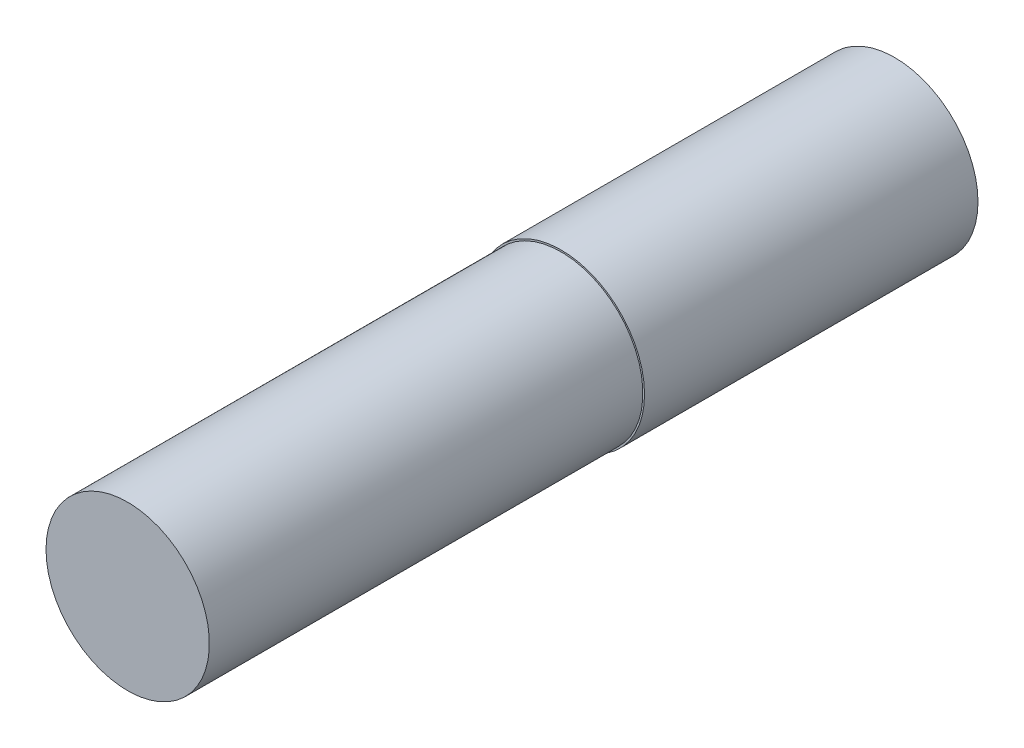
ISO-10303-21;
HEADER;
FILE_DESCRIPTION(('STEP AP214'),'2;1');
FILE_NAME('part.step','',(''),(''),'','','');
FILE_SCHEMA(('AUTOMOTIVE_DESIGN { 1 0 10303 214 1 1 1 1 }'));
ENDSEC;
DATA;
#1=APPLICATION_CONTEXT('core data for automotive mechanical design processes');
#2=APPLICATION_PROTOCOL_DEFINITION('international standard','automotive_design',2000,#1);
#3=PRODUCT_CONTEXT('',#1,'mechanical');
#4=PRODUCT('Part','Part','',(#3));
#5=PRODUCT_RELATED_PRODUCT_CATEGORY('part','',(#4));
#6=PRODUCT_DEFINITION_FORMATION('','',#4);
#7=PRODUCT_DEFINITION_CONTEXT('part definition',#1,'design');
#8=PRODUCT_DEFINITION('design','',#6,#7);
#9=PRODUCT_DEFINITION_SHAPE('','',#8);
#10=(LENGTH_UNIT() NAMED_UNIT(*) SI_UNIT(.MILLI.,.METRE.));
#11=(NAMED_UNIT(*) PLANE_ANGLE_UNIT() SI_UNIT($,.RADIAN.));
#12=(NAMED_UNIT(*) SI_UNIT($,.STERADIAN.) SOLID_ANGLE_UNIT());
#13=UNCERTAINTY_MEASURE_WITH_UNIT(LENGTH_MEASURE(1.E-05),#10,'distance_accuracy_value','');
#14=(GEOMETRIC_REPRESENTATION_CONTEXT(3) GLOBAL_UNCERTAINTY_ASSIGNED_CONTEXT((#13)) GLOBAL_UNIT_ASSIGNED_CONTEXT((#10,
#11,#12)) REPRESENTATION_CONTEXT('',''));
#15=CARTESIAN_POINT('',(0.,0.,0.));
#16=DIRECTION('',(0.,0.,1.));
#17=DIRECTION('',(1.,0.,0.));
#18=AXIS2_PLACEMENT_3D('',#15,#16,#17);
#19=CARTESIAN_POINT('',(0.,0.,10.));
#20=DIRECTION('',(0.,0.,-1.));
#21=DIRECTION('',(-1.,0.,0.));
#22=AXIS2_PLACEMENT_3D('',#19,#20,#21);
#23=CYLINDRICAL_SURFACE('',#22,2.5);
#24=CARTESIAN_POINT('',(0.,0.,10.));
#25=DIRECTION('',(0.,0.,1.));
#26=DIRECTION('',(1.,0.,0.));
#27=AXIS2_PLACEMENT_3D('',#24,#25,#26);
#28=CIRCLE('',#27,2.5);
#29=CARTESIAN_POINT('',(2.5,0.,10.));
#30=VERTEX_POINT('',#29);
#31=EDGE_CURVE('E39',#30,#30,#28,.T.);
#32=ORIENTED_EDGE('',*,*,#31,.F.);
#33=EDGE_LOOP('',(#32));
#34=FACE_BOUND('',#33,.T.);
#35=CARTESIAN_POINT('',(0.,0.,0.));
#36=DIRECTION('',(0.,0.,1.));
#37=DIRECTION('',(1.,0.,0.));
#38=AXIS2_PLACEMENT_3D('',#35,#36,#37);
#39=CIRCLE('',#38,2.5);
#40=CARTESIAN_POINT('',(2.5,0.,0.));
#41=VERTEX_POINT('',#40);
#42=EDGE_CURVE('E35',#41,#41,#39,.T.);
#43=ORIENTED_EDGE('',*,*,#42,.T.);
#44=EDGE_LOOP('',(#43));
#45=FACE_BOUND('',#44,.T.);
#46=ADVANCED_FACE('F32',(#34,#45),#23,.T.);
#47=CARTESIAN_POINT('',(0.,0.,10.));
#48=DIRECTION('',(0.,0.,1.));
#49=DIRECTION('',(1.,0.,0.));
#50=AXIS2_PLACEMENT_3D('',#47,#48,#49);
#51=PLANE('',#50);
#52=CARTESIAN_POINT('',(0.,0.,10.));
#53=DIRECTION('',(0.,0.,1.));
#54=DIRECTION('',(1.,0.,0.));
#55=AXIS2_PLACEMENT_3D('',#52,#53,#54);
#56=CIRCLE('',#55,2.45);
#57=CARTESIAN_POINT('',(-2.45,0.,10.));
#58=VERTEX_POINT('',#57);
#59=EDGE_CURVE('E10',#58,#58,#56,.T.);
#60=ORIENTED_EDGE('',*,*,#59,.F.);
#61=EDGE_LOOP('',(#60));
#62=FACE_BOUND('',#61,.T.);
#63=ORIENTED_EDGE('',*,*,#31,.T.);
#64=EDGE_LOOP('',(#63));
#65=FACE_BOUND('',#64,.T.);
#66=ADVANCED_FACE('F56',(#62,#65),#51,.T.);
#67=CARTESIAN_POINT('',(0.,0.,0.));
#68=DIRECTION('',(0.,0.,1.));
#69=DIRECTION('',(1.,0.,0.));
#70=AXIS2_PLACEMENT_3D('',#67,#68,#69);
#71=PLANE('',#70);
#72=ORIENTED_EDGE('',*,*,#42,.F.);
#73=EDGE_LOOP('',(#72));
#74=FACE_BOUND('',#73,.T.);
#75=ADVANCED_FACE('F53',(#74),#71,.F.);
#76=CARTESIAN_POINT('',(0.,0.,23.));
#77=DIRECTION('',(0.,0.,-1.));
#78=DIRECTION('',(-1.,0.,0.));
#79=AXIS2_PLACEMENT_3D('',#76,#77,#78);
#80=CYLINDRICAL_SURFACE('',#79,2.45);
#81=CARTESIAN_POINT('',(0.,0.,23.));
#82=DIRECTION('',(0.,0.,1.));
#83=DIRECTION('',(1.,0.,0.));
#84=AXIS2_PLACEMENT_3D('',#81,#82,#83);
#85=CIRCLE('',#84,2.45);
#86=CARTESIAN_POINT('',(-2.45,0.,23.));
#87=VERTEX_POINT('',#86);
#88=EDGE_CURVE('E45',#87,#87,#85,.T.);
#89=CARTESIAN_POINT('',(-2.45,0.,23.));
#90=CARTESIAN_POINT('',(-2.45,0.,22.8645833333333));
#91=CARTESIAN_POINT('',(-2.45,0.,22.7291666666667));
#92=CARTESIAN_POINT('',(-2.45,0.,22.4583333333333));
#93=CARTESIAN_POINT('',(-2.45,0.,22.3229166666667));
#94=CARTESIAN_POINT('',(-2.45,0.,22.0520833333333));
#95=CARTESIAN_POINT('',(-2.45,0.,21.9166666666667));
#96=CARTESIAN_POINT('',(-2.45,0.,21.6458333333333));
#97=CARTESIAN_POINT('',(-2.45,0.,21.5104166666667));
#98=CARTESIAN_POINT('',(-2.45,0.,21.2395833333333));
#99=CARTESIAN_POINT('',(-2.45,0.,21.1041666666667));
#100=CARTESIAN_POINT('',(-2.45,0.,20.8333333333333));
#101=CARTESIAN_POINT('',(-2.45,0.,20.6979166666667));
#102=CARTESIAN_POINT('',(-2.45,0.,20.4270833333333));
#103=CARTESIAN_POINT('',(-2.45,0.,20.2916666666667));
#104=CARTESIAN_POINT('',(-2.45,0.,20.0208333333333));
#105=CARTESIAN_POINT('',(-2.45,0.,19.8854166666667));
#106=CARTESIAN_POINT('',(-2.45,0.,19.6145833333333));
#107=CARTESIAN_POINT('',(-2.45,0.,19.4791666666667));
#108=CARTESIAN_POINT('',(-2.45,0.,19.2083333333333));
#109=CARTESIAN_POINT('',(-2.45,0.,19.0729166666667));
#110=CARTESIAN_POINT('',(-2.45,0.,18.8020833333333));
#111=CARTESIAN_POINT('',(-2.45,0.,18.6666666666667));
#112=CARTESIAN_POINT('',(-2.45,0.,18.3958333333333));
#113=CARTESIAN_POINT('',(-2.45,0.,18.2604166666667));
#114=CARTESIAN_POINT('',(-2.45,0.,17.9895833333333));
#115=CARTESIAN_POINT('',(-2.45,0.,17.8541666666667));
#116=CARTESIAN_POINT('',(-2.45,0.,17.5833333333333));
#117=CARTESIAN_POINT('',(-2.45,0.,17.4479166666667));
#118=CARTESIAN_POINT('',(-2.45,0.,17.1770833333333));
#119=CARTESIAN_POINT('',(-2.45,0.,17.0416666666667));
#120=CARTESIAN_POINT('',(-2.45,0.,16.7708333333333));
#121=CARTESIAN_POINT('',(-2.45,0.,16.6354166666667));
#122=CARTESIAN_POINT('',(-2.45,0.,16.3645833333333));
#123=CARTESIAN_POINT('',(-2.45,0.,16.2291666666667));
#124=CARTESIAN_POINT('',(-2.45,0.,15.9583333333333));
#125=CARTESIAN_POINT('',(-2.45,0.,15.8229166666667));
#126=CARTESIAN_POINT('',(-2.45,0.,15.5520833333333));
#127=CARTESIAN_POINT('',(-2.45,0.,15.4166666666667));
#128=CARTESIAN_POINT('',(-2.45,0.,15.1458333333333));
#129=CARTESIAN_POINT('',(-2.45,0.,15.0104166666667));
#130=CARTESIAN_POINT('',(-2.45,0.,14.7395833333333));
#131=CARTESIAN_POINT('',(-2.45,0.,14.6041666666667));
#132=CARTESIAN_POINT('',(-2.45,0.,14.3333333333333));
#133=CARTESIAN_POINT('',(-2.45,0.,14.1979166666667));
#134=CARTESIAN_POINT('',(-2.45,0.,13.9270833333333));
#135=CARTESIAN_POINT('',(-2.45,0.,13.7916666666667));
#136=CARTESIAN_POINT('',(-2.45,0.,13.5208333333333));
#137=CARTESIAN_POINT('',(-2.45,0.,13.3854166666667));
#138=CARTESIAN_POINT('',(-2.45,0.,13.1145833333333));
#139=CARTESIAN_POINT('',(-2.45,0.,12.9791666666667));
#140=CARTESIAN_POINT('',(-2.45,0.,12.7083333333333));
#141=CARTESIAN_POINT('',(-2.45,0.,12.5729166666667));
#142=CARTESIAN_POINT('',(-2.45,0.,12.3020833333333));
#143=CARTESIAN_POINT('',(-2.45,0.,12.1666666666667));
#144=CARTESIAN_POINT('',(-2.45,0.,11.8958333333333));
#145=CARTESIAN_POINT('',(-2.45,0.,11.7604166666667));
#146=CARTESIAN_POINT('',(-2.45,0.,11.4895833333333));
#147=CARTESIAN_POINT('',(-2.45,0.,11.3541666666667));
#148=CARTESIAN_POINT('',(-2.45,0.,11.0833333333333));
#149=CARTESIAN_POINT('',(-2.45,0.,10.9479166666667));
#150=CARTESIAN_POINT('',(-2.45,0.,10.6770833333333));
#151=CARTESIAN_POINT('',(-2.45,0.,10.5416666666667));
#152=CARTESIAN_POINT('',(-2.45,0.,10.2708333333333));
#153=CARTESIAN_POINT('',(-2.45,0.,10.1354166666667));
#154=CARTESIAN_POINT('',(-2.45,0.,10.));
#155=B_SPLINE_CURVE_WITH_KNOTS('',3,(#89,#90,#91,#92,#93,#94,#95,#96,#97,#98,#99,#100,#101,#102,
#103,#104,#105,#106,#107,#108,#109,#110,#111,#112,#113,#114,#115,#116,#117,#118,#119,#120,#121,
#122,#123,#124,#125,#126,#127,#128,#129,#130,#131,#132,#133,#134,#135,#136,#137,#138,#139,#140,
#141,#142,#143,#144,#145,#146,#147,#148,#149,#150,#151,#152,#153,#154),.UNSPECIFIED.,.F.,.F.,(4,
2,2,2,2,2,2,2,2,2,2,2,2,2,2,2,2,2,2,2,2,2,2,2,2,2,2,2,2,2,2,2,4),(0.,0.406249999999997,
0.812499999999997,1.21875,1.625,2.03125,2.4375,2.84375,3.25,3.65625,4.0625,4.46875,4.875,
5.28125,5.6875,6.09375,6.5,6.90625,7.3125,7.71875,8.125,8.53124999999999,8.9375,9.34375,9.75,
10.15625,10.5625,10.96875,11.375,11.78125,12.1875,12.59375,13.),.UNSPECIFIED.);
#156=EDGE_CURVE('BSEAM55',#87,#58,#155,.T.);
#157=ORIENTED_EDGE('',*,*,#88,.F.);
#158=ORIENTED_EDGE('',*,*,#59,.T.);
#159=ORIENTED_EDGE('',*,*,#156,.T.);
#160=ORIENTED_EDGE('',*,*,#156,.F.);
#161=EDGE_LOOP('',(#157,#159,#158,#160));
#162=FACE_BOUND('',#161,.T.);
#163=ADVANCED_FACE('F55',(#162),#80,.T.);
#164=CARTESIAN_POINT('',(0.,0.,23.));
#165=DIRECTION('',(0.,0.,1.));
#166=DIRECTION('',(1.,0.,0.));
#167=AXIS2_PLACEMENT_3D('',#164,#165,#166);
#168=PLANE('',#167);
#169=ORIENTED_EDGE('',*,*,#88,.T.);
#170=EDGE_LOOP('',(#169));
#171=FACE_BOUND('',#170,.T.);
#172=ADVANCED_FACE('F61',(#171),#168,.T.);
#173=CLOSED_SHELL('',(#46,#66,#75,#163,#172));
#174=MANIFOLD_SOLID_BREP('B2',#173);
#175=ADVANCED_BREP_SHAPE_REPRESENTATION('',(#18,#174),#14);
#176=SHAPE_DEFINITION_REPRESENTATION(#9,#175);
ENDSEC;
END-ISO-10303-21;
